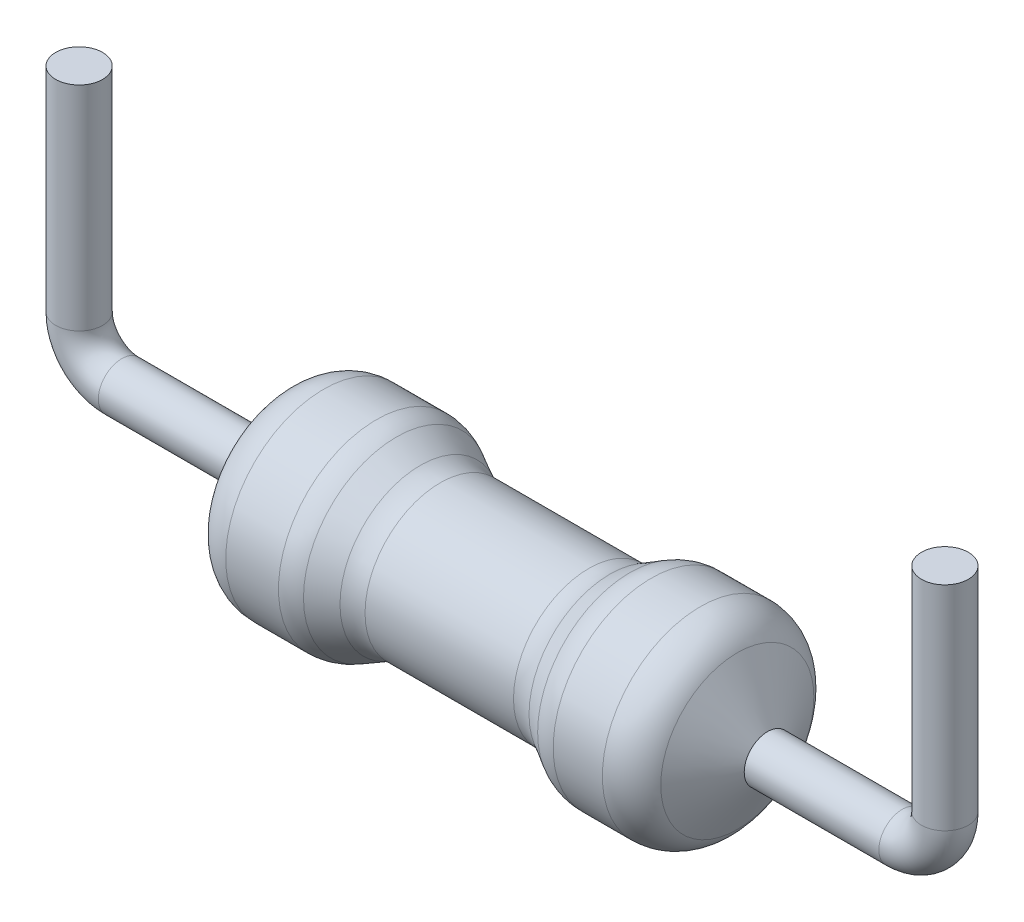
ISO-10303-21;
HEADER;
FILE_DESCRIPTION(('STEP AP214'),'2;1');
FILE_NAME('part.step','',(''),(''),'','','');
FILE_SCHEMA(('AUTOMOTIVE_DESIGN { 1 0 10303 214 1 1 1 1 }'));
ENDSEC;
DATA;
#1=APPLICATION_CONTEXT('core data for automotive mechanical design processes');
#2=APPLICATION_PROTOCOL_DEFINITION('international standard','automotive_design',2000,#1);
#3=PRODUCT_CONTEXT('',#1,'mechanical');
#4=PRODUCT('Part','Part','',(#3));
#5=PRODUCT_RELATED_PRODUCT_CATEGORY('part','',(#4));
#6=PRODUCT_DEFINITION_FORMATION('','',#4);
#7=PRODUCT_DEFINITION_CONTEXT('part definition',#1,'design');
#8=PRODUCT_DEFINITION('design','',#6,#7);
#9=PRODUCT_DEFINITION_SHAPE('','',#8);
#10=(LENGTH_UNIT() NAMED_UNIT(*) SI_UNIT(.MILLI.,.METRE.));
#11=(NAMED_UNIT(*) PLANE_ANGLE_UNIT() SI_UNIT($,.RADIAN.));
#12=(NAMED_UNIT(*) SI_UNIT($,.STERADIAN.) SOLID_ANGLE_UNIT());
#13=UNCERTAINTY_MEASURE_WITH_UNIT(LENGTH_MEASURE(1.E-05),#10,'distance_accuracy_value','');
#14=(GEOMETRIC_REPRESENTATION_CONTEXT(3) GLOBAL_UNCERTAINTY_ASSIGNED_CONTEXT((#13)) GLOBAL_UNIT_ASSIGNED_CONTEXT((#10,
#11,#12)) REPRESENTATION_CONTEXT('',''));
#15=CARTESIAN_POINT('',(0.,0.,0.));
#16=DIRECTION('',(0.,0.,1.));
#17=DIRECTION('',(1.,0.,0.));
#18=AXIS2_PLACEMENT_3D('',#15,#16,#17);
#19=CARTESIAN_POINT('',(3.,0.,0.));
#20=DIRECTION('',(-1.,0.,0.));
#21=DIRECTION('',(0.,0.,1.));
#22=AXIS2_PLACEMENT_3D('',#19,#20,#21);
#23=CONICAL_SURFACE('',#22,0.275,1.05165021254837);
#24=CARTESIAN_POINT('',(2.64396030332662,0.,0.));
#25=DIRECTION('',(1.,0.,0.));
#26=DIRECTION('',(0.,0.,-1.));
#27=AXIS2_PLACEMENT_3D('',#24,#25,#26);
#28=CIRCLE('',#27,0.898069469178417);
#29=CARTESIAN_POINT('',(2.64396030332662,0.,0.898069469178417));
#30=VERTEX_POINT('',#29);
#31=EDGE_CURVE('E11',#30,#30,#28,.T.);
#32=CARTESIAN_POINT('',(3.,0.,0.));
#33=DIRECTION('',(-1.,0.,0.));
#34=DIRECTION('',(0.,0.,1.));
#35=AXIS2_PLACEMENT_3D('',#32,#33,#34);
#36=CIRCLE('',#35,0.275);
#37=CARTESIAN_POINT('',(3.,0.,0.275));
#38=VERTEX_POINT('',#37);
#39=EDGE_CURVE('E53',#38,#38,#36,.T.);
#40=CARTESIAN_POINT('',(2.64396030332662,0.,0.898069469178417));
#41=CARTESIAN_POINT('',(2.64766905016697,0.,0.891579162207808));
#42=CARTESIAN_POINT('',(2.65137779700731,0.,0.8850888552372));
#43=CARTESIAN_POINT('',(2.65879529068801,0.,0.872108241295983));
#44=CARTESIAN_POINT('',(2.66250403752836,0.,0.865617934325374));
#45=CARTESIAN_POINT('',(2.66992153120905,0.,0.852637320384157));
#46=CARTESIAN_POINT('',(2.6736302780494,0.,0.846147013413549));
#47=CARTESIAN_POINT('',(2.6810477717301,0.,0.833166399472332));
#48=CARTESIAN_POINT('',(2.68475651857044,0.,0.826676092501723));
#49=CARTESIAN_POINT('',(2.69217401225114,0.,0.813695478560506));
#50=CARTESIAN_POINT('',(2.69588275909149,0.,0.807205171589898));
#51=CARTESIAN_POINT('',(2.70330025277218,0.,0.794224557648681));
#52=CARTESIAN_POINT('',(2.70700899961253,0.,0.787734250678072));
#53=CARTESIAN_POINT('',(2.71442649329323,0.,0.774753636736855));
#54=CARTESIAN_POINT('',(2.71813524013357,0.,0.768263329766247));
#55=CARTESIAN_POINT('',(2.72555273381427,0.,0.75528271582503));
#56=CARTESIAN_POINT('',(2.72926148065462,0.,0.748792408854421));
#57=CARTESIAN_POINT('',(2.73667897433531,0.,0.735811794913204));
#58=CARTESIAN_POINT('',(2.74038772117566,0.,0.729321487942596));
#59=CARTESIAN_POINT('',(2.74780521485635,0.,0.716340874001378));
#60=CARTESIAN_POINT('',(2.7515139616967,0.,0.70985056703077));
#61=CARTESIAN_POINT('',(2.7589314553774,0.,0.696869953089553));
#62=CARTESIAN_POINT('',(2.76264020221775,0.,0.690379646118944));
#63=CARTESIAN_POINT('',(2.77005769589844,0.,0.677399032177727));
#64=CARTESIAN_POINT('',(2.77376644273879,0.,0.670908725207119));
#65=CARTESIAN_POINT('',(2.78118393641948,0.,0.657928111265902));
#66=CARTESIAN_POINT('',(2.78489268325983,0.,0.651437804295293));
#67=CARTESIAN_POINT('',(2.79231017694053,0.,0.638457190354076));
#68=CARTESIAN_POINT('',(2.79601892378088,0.,0.631966883383468));
#69=CARTESIAN_POINT('',(2.80343641746157,0.,0.618986269442251));
#70=CARTESIAN_POINT('',(2.80714516430192,0.,0.612495962471642));
#71=CARTESIAN_POINT('',(2.81456265798261,0.,0.599515348530425));
#72=CARTESIAN_POINT('',(2.81827140482296,0.,0.593025041559817));
#73=CARTESIAN_POINT('',(2.82568889850366,0.,0.5800444276186));
#74=CARTESIAN_POINT('',(2.82939764534401,0.,0.573554120647991));
#75=CARTESIAN_POINT('',(2.8368151390247,0.,0.560573506706774));
#76=CARTESIAN_POINT('',(2.84052388586505,0.,0.554083199736166));
#77=CARTESIAN_POINT('',(2.84794137954574,0.,0.541102585794949));
#78=CARTESIAN_POINT('',(2.85165012638609,0.,0.53461227882434));
#79=CARTESIAN_POINT('',(2.85906762006679,0.,0.521631664883123));
#80=CARTESIAN_POINT('',(2.86277636690713,0.,0.515141357912515));
#81=CARTESIAN_POINT('',(2.87019386058783,0.,0.502160743971298));
#82=CARTESIAN_POINT('',(2.87390260742818,0.,0.495670437000689));
#83=CARTESIAN_POINT('',(2.88132010110887,0.,0.482689823059472));
#84=CARTESIAN_POINT('',(2.88502884794922,0.,0.476199516088863));
#85=CARTESIAN_POINT('',(2.89244634162992,0.,0.463218902147646));
#86=CARTESIAN_POINT('',(2.89615508847026,0.,0.456728595177038));
#87=CARTESIAN_POINT('',(2.90357258215096,0.,0.443747981235821));
#88=CARTESIAN_POINT('',(2.90728132899131,0.,0.437257674265212));
#89=CARTESIAN_POINT('',(2.914698822672,0.,0.424277060323995));
#90=CARTESIAN_POINT('',(2.91840756951235,0.,0.417786753353387));
#91=CARTESIAN_POINT('',(2.92582506319305,0.,0.40480613941217));
#92=CARTESIAN_POINT('',(2.92953381003339,0.,0.398315832441561));
#93=CARTESIAN_POINT('',(2.93695130371409,0.,0.385335218500344));
#94=CARTESIAN_POINT('',(2.94066005055444,0.,0.378844911529736));
#95=CARTESIAN_POINT('',(2.94807754423513,0.,0.365864297588519));
#96=CARTESIAN_POINT('',(2.95178629107548,0.,0.35937399061791));
#97=CARTESIAN_POINT('',(2.95920378475618,0.,0.346393376676693));
#98=CARTESIAN_POINT('',(2.96291253159652,0.,0.339903069706085));
#99=CARTESIAN_POINT('',(2.97033002527722,0.,0.326922455764868));
#100=CARTESIAN_POINT('',(2.97403877211757,0.,0.320432148794259));
#101=CARTESIAN_POINT('',(2.98145626579826,0.,0.307451534853042));
#102=CARTESIAN_POINT('',(2.98516501263861,0.,0.300961227882434));
#103=CARTESIAN_POINT('',(2.9925825063193,0.,0.287980613941217));
#104=CARTESIAN_POINT('',(2.99629125315965,0.,0.281490306970608));
#105=CARTESIAN_POINT('',(3.,0.,0.275));
#106=B_SPLINE_CURVE_WITH_KNOTS('',3,(#40,#41,#42,#43,#44,#45,#46,#47,#48,#49,#50,#51,#52,#53,
#54,#55,#56,#57,#58,#59,#60,#61,#62,#63,#64,#65,#66,#67,#68,#69,#70,#71,#72,#73,#74,#75,#76,#77,
#78,#79,#80,#81,#82,#83,#84,#85,#86,#87,#88,#89,#90,#91,#92,#93,#94,#95,#96,#97,#98,#99,#100,
#101,#102,#103,#104,#105),.UNSPECIFIED.,.F.,.F.,(4,2,2,2,2,2,2,2,2,2,2,2,2,2,2,2,2,2,2,2,2,2,2,
2,2,2,2,2,2,2,2,2,4),(0.,0.0224256547125532,0.0448513094251064,0.0672769641376601,
0.0897026188502135,0.112128273562767,0.13455392827532,0.156979582987874,0.179405237700427,
0.20183089241298,0.224256547125534,0.246682201838087,0.269107856550641,0.291533511263194,
0.313959165975747,0.336384820688301,0.358810475400854,0.381236130113408,0.403661784825961,
0.426087439538515,0.448513094251068,0.470938748963621,0.493364403676175,0.515790058388728,
0.538215713101281,0.560641367813835,0.583067022526388,0.605492677238942,0.627918331951495,
0.650343986664048,0.672769641376602,0.695195296089155,0.717620950801708),.UNSPECIFIED.);
#107=EDGE_CURVE('BSEAM33',#30,#38,#106,.T.);
#108=ORIENTED_EDGE('',*,*,#31,.T.);
#109=ORIENTED_EDGE('',*,*,#39,.T.);
#110=ORIENTED_EDGE('',*,*,#107,.T.);
#111=ORIENTED_EDGE('',*,*,#107,.F.);
#112=EDGE_LOOP('',(#108,#110,#109,#111));
#113=FACE_BOUND('',#112,.T.);
#114=ADVANCED_FACE('F33',(#113),#23,.T.);
#115=CARTESIAN_POINT('',(0.,0.,0.));
#116=DIRECTION('',(-1.,0.,0.));
#117=DIRECTION('',(0.,0.,1.));
#118=AXIS2_PLACEMENT_3D('',#115,#116,#117);
#119=CYLINDRICAL_SURFACE('',#118,1.15);
#120=CARTESIAN_POINT('',(1.63278221853732,0.,0.));
#121=DIRECTION('',(1.,0.,0.));
#122=DIRECTION('',(0.,0.,-1.));
#123=AXIS2_PLACEMENT_3D('',#120,#121,#122);
#124=CIRCLE('',#123,1.15);
#125=CARTESIAN_POINT('',(1.63278221853732,0.,-1.15));
#126=VERTEX_POINT('',#125);
#127=EDGE_CURVE('E41',#126,#126,#124,.T.);
#128=ORIENTED_EDGE('',*,*,#127,.T.);
#129=EDGE_LOOP('',(#128));
#130=FACE_BOUND('',#129,.T.);
#131=CARTESIAN_POINT('',(2.20983873226439,0.,0.));
#132=DIRECTION('',(1.,0.,0.));
#133=DIRECTION('',(0.,0.,-1.));
#134=AXIS2_PLACEMENT_3D('',#131,#132,#133);
#135=CIRCLE('',#134,1.15);
#136=CARTESIAN_POINT('',(2.20983873226439,0.,-1.15));
#137=VERTEX_POINT('',#136);
#138=EDGE_CURVE('E93',#137,#137,#135,.F.);
#139=ORIENTED_EDGE('',*,*,#138,.T.);
#140=EDGE_LOOP('',(#139));
#141=FACE_BOUND('',#140,.T.);
#142=ADVANCED_FACE('F98',(#130,#141),#119,.T.);
#143=CARTESIAN_POINT('',(1.5,0.,0.));
#144=DIRECTION('',(1.,0.,0.));
#145=DIRECTION('',(0.,0.,-1.));
#146=AXIS2_PLACEMENT_3D('',#143,#144,#145);
#147=CONICAL_SURFACE('',#146,1.15,0.519146114246524);
#148=CARTESIAN_POINT('',(1.14909833092873,0.,0.));
#149=DIRECTION('',(1.,0.,0.));
#150=DIRECTION('',(0.,0.,-1.));
#151=AXIS2_PLACEMENT_3D('',#148,#149,#150);
#152=CIRCLE('',#151,0.949484760530703);
#153=CARTESIAN_POINT('',(1.14909833092873,0.,-0.949484760530703));
#154=VERTEX_POINT('',#153);
#155=EDGE_CURVE('E90',#154,#154,#152,.T.);
#156=ORIENTED_EDGE('',*,*,#155,.T.);
#157=EDGE_LOOP('',(#156));
#158=FACE_BOUND('',#157,.T.);
#159=CARTESIAN_POINT('',(1.3847127493589,0.,0.));
#160=DIRECTION('',(-1.,0.,0.));
#161=DIRECTION('',(0.,0.,1.));
#162=AXIS2_PLACEMENT_3D('',#159,#160,#161);
#163=CIRCLE('',#162,1.08412157106223);
#164=CARTESIAN_POINT('',(1.3847127493589,0.,1.08412157106223));
#165=VERTEX_POINT('',#164);
#166=EDGE_CURVE('E87',#165,#165,#163,.T.);
#167=ORIENTED_EDGE('',*,*,#166,.T.);
#168=EDGE_LOOP('',(#167));
#169=FACE_BOUND('',#168,.T.);
#170=ADVANCED_FACE('F107',(#158,#169),#147,.T.);
#171=CARTESIAN_POINT('',(0.,0.,0.));
#172=DIRECTION('',(-1.,0.,0.));
#173=DIRECTION('',(0.,0.,1.));
#174=AXIS2_PLACEMENT_3D('',#171,#172,#173);
#175=CYLINDRICAL_SURFACE('',#174,0.883606331592932);
#176=CARTESIAN_POINT('',(-0.841301852192726,0.,0.));
#177=DIRECTION('',(-1.,0.,0.));
#178=DIRECTION('',(0.,0.,1.));
#179=AXIS2_PLACEMENT_3D('',#176,#177,#178);
#180=CIRCLE('',#179,0.883606331592932);
#181=CARTESIAN_POINT('',(-0.841301852192726,0.,0.883606331592932));
#182=VERTEX_POINT('',#181);
#183=EDGE_CURVE('E84',#182,#182,#180,.F.);
#184=ORIENTED_EDGE('',*,*,#183,.T.);
#185=EDGE_LOOP('',(#184));
#186=FACE_BOUND('',#185,.T.);
#187=CARTESIAN_POINT('',(0.901028861750313,0.,0.));
#188=DIRECTION('',(-1.,0.,0.));
#189=DIRECTION('',(0.,0.,1.));
#190=AXIS2_PLACEMENT_3D('',#187,#188,#189);
#191=CIRCLE('',#190,0.883606331592932);
#192=CARTESIAN_POINT('',(0.901028861750313,0.,0.883606331592932));
#193=VERTEX_POINT('',#192);
#194=EDGE_CURVE('E81',#193,#193,#191,.T.);
#195=ORIENTED_EDGE('',*,*,#194,.T.);
#196=EDGE_LOOP('',(#195));
#197=FACE_BOUND('',#196,.T.);
#198=ADVANCED_FACE('F109',(#186,#197),#175,.T.);
#199=CARTESIAN_POINT('',(-0.966188919712368,0.,0.));
#200=DIRECTION('',(-1.,0.,0.));
#201=DIRECTION('',(0.,0.,1.));
#202=AXIS2_PLACEMENT_3D('',#199,#200,#201);
#203=CONICAL_SURFACE('',#202,0.883606331592932,0.489532146090949);
#204=CARTESIAN_POINT('',(-1.3559694703309,0.,0.));
#205=DIRECTION('',(1.,0.,0.));
#206=DIRECTION('',(0.,0.,-1.));
#207=AXIS2_PLACEMENT_3D('',#204,#205,#206);
#208=CIRCLE('',#207,1.09127647309893);
#209=CARTESIAN_POINT('',(-1.3559694703309,0.,-1.09127647309893));
#210=VERTEX_POINT('',#209);
#211=EDGE_CURVE('E78',#210,#210,#208,.T.);
#212=ORIENTED_EDGE('',*,*,#211,.T.);
#213=EDGE_LOOP('',(#212));
#214=FACE_BOUND('',#213,.T.);
#215=CARTESIAN_POINT('',(-1.07640836909384,0.,0.));
#216=DIRECTION('',(-1.,0.,0.));
#217=DIRECTION('',(0.,0.,1.));
#218=AXIS2_PLACEMENT_3D('',#215,#216,#217);
#219=CIRCLE('',#218,0.942329858494006);
#220=CARTESIAN_POINT('',(-1.07640836909384,0.,0.942329858494006));
#221=VERTEX_POINT('',#220);
#222=EDGE_CURVE('E75',#221,#221,#219,.T.);
#223=ORIENTED_EDGE('',*,*,#222,.T.);
#224=EDGE_LOOP('',(#223));
#225=FACE_BOUND('',#224,.T.);
#226=ADVANCED_FACE('F116',(#214,#225),#203,.T.);
#227=CARTESIAN_POINT('',(0.,0.,0.));
#228=DIRECTION('',(-1.,0.,0.));
#229=DIRECTION('',(0.,0.,1.));
#230=AXIS2_PLACEMENT_3D('',#227,#228,#229);
#231=CYLINDRICAL_SURFACE('',#230,1.15);
#232=CARTESIAN_POINT('',(-2.20983873226439,0.,0.));
#233=DIRECTION('',(1.,0.,0.));
#234=DIRECTION('',(0.,0.,-1.));
#235=AXIS2_PLACEMENT_3D('',#232,#233,#234);
#236=CIRCLE('',#235,1.15);
#237=CARTESIAN_POINT('',(-2.20983873226439,0.,-1.15));
#238=VERTEX_POINT('',#237);
#239=EDGE_CURVE('E72',#238,#238,#236,.T.);
#240=ORIENTED_EDGE('',*,*,#239,.T.);
#241=EDGE_LOOP('',(#240));
#242=FACE_BOUND('',#241,.T.);
#243=CARTESIAN_POINT('',(-1.59107598723201,0.,0.));
#244=DIRECTION('',(1.,0.,0.));
#245=DIRECTION('',(0.,0.,-1.));
#246=AXIS2_PLACEMENT_3D('',#243,#244,#245);
#247=CIRCLE('',#246,1.15);
#248=CARTESIAN_POINT('',(-1.59107598723201,0.,-1.15));
#249=VERTEX_POINT('',#248);
#250=EDGE_CURVE('E69',#249,#249,#247,.F.);
#251=ORIENTED_EDGE('',*,*,#250,.T.);
#252=EDGE_LOOP('',(#251));
#253=FACE_BOUND('',#252,.T.);
#254=ADVANCED_FACE('F263',(#242,#253),#231,.T.);
#255=CARTESIAN_POINT('',(-2.5,0.,0.));
#256=DIRECTION('',(1.,0.,0.));
#257=DIRECTION('',(0.,0.,-1.));
#258=AXIS2_PLACEMENT_3D('',#255,#256,#257);
#259=CONICAL_SURFACE('',#258,1.15,1.05165021254837);
#260=CARTESIAN_POINT('',(-2.64396030332662,0.,0.));
#261=DIRECTION('',(-1.,0.,0.));
#262=DIRECTION('',(0.,0.,1.));
#263=AXIS2_PLACEMENT_3D('',#260,#261,#262);
#264=CIRCLE('',#263,0.898069469178417);
#265=CARTESIAN_POINT('',(-2.64396030332662,0.,-0.898069469178417));
#266=VERTEX_POINT('',#265);
#267=EDGE_CURVE('E66',#266,#266,#264,.T.);
#268=CARTESIAN_POINT('',(-3.,0.,0.));
#269=DIRECTION('',(-1.,0.,0.));
#270=DIRECTION('',(0.,0.,1.));
#271=AXIS2_PLACEMENT_3D('',#268,#269,#270);
#272=CIRCLE('',#271,0.274999999999999);
#273=CARTESIAN_POINT('',(-3.,0.,-0.274999999999999));
#274=VERTEX_POINT('',#273);
#275=EDGE_CURVE('E57',#274,#274,#272,.T.);
#276=CARTESIAN_POINT('',(-2.64396030332662,0.,-0.898069469178417));
#277=CARTESIAN_POINT('',(-2.64766905016697,0.,-0.891579162207809));
#278=CARTESIAN_POINT('',(-2.65137779700731,0.,-0.8850888552372));
#279=CARTESIAN_POINT('',(-2.65879529068801,0.,-0.872108241295983));
#280=CARTESIAN_POINT('',(-2.66250403752836,0.,-0.865617934325375));
#281=CARTESIAN_POINT('',(-2.66992153120905,0.,-0.852637320384158));
#282=CARTESIAN_POINT('',(-2.6736302780494,0.,-0.846147013413549));
#283=CARTESIAN_POINT('',(-2.6810477717301,0.,-0.833166399472332));
#284=CARTESIAN_POINT('',(-2.68475651857044,0.,-0.826676092501724));
#285=CARTESIAN_POINT('',(-2.69217401225114,0.,-0.813695478560507));
#286=CARTESIAN_POINT('',(-2.69588275909149,0.,-0.807205171589898));
#287=CARTESIAN_POINT('',(-2.70330025277218,0.,-0.794224557648681));
#288=CARTESIAN_POINT('',(-2.70700899961253,0.,-0.787734250678072));
#289=CARTESIAN_POINT('',(-2.71442649329322,0.,-0.774753636736855));
#290=CARTESIAN_POINT('',(-2.71813524013357,0.,-0.768263329766247));
#291=CARTESIAN_POINT('',(-2.72555273381427,0.,-0.75528271582503));
#292=CARTESIAN_POINT('',(-2.72926148065462,0.,-0.748792408854421));
#293=CARTESIAN_POINT('',(-2.73667897433531,0.,-0.735811794913204));
#294=CARTESIAN_POINT('',(-2.74038772117566,0.,-0.729321487942596));
#295=CARTESIAN_POINT('',(-2.74780521485635,0.,-0.716340874001379));
#296=CARTESIAN_POINT('',(-2.7515139616967,0.,-0.70985056703077));
#297=CARTESIAN_POINT('',(-2.7589314553774,0.,-0.696869953089553));
#298=CARTESIAN_POINT('',(-2.76264020221775,0.,-0.690379646118944));
#299=CARTESIAN_POINT('',(-2.77005769589844,0.,-0.677399032177727));
#300=CARTESIAN_POINT('',(-2.77376644273879,0.,-0.670908725207119));
#301=CARTESIAN_POINT('',(-2.78118393641948,0.,-0.657928111265902));
#302=CARTESIAN_POINT('',(-2.78489268325983,0.,-0.651437804295294));
#303=CARTESIAN_POINT('',(-2.79231017694053,0.,-0.638457190354076));
#304=CARTESIAN_POINT('',(-2.79601892378088,0.,-0.631966883383468));
#305=CARTESIAN_POINT('',(-2.80343641746157,0.,-0.618986269442251));
#306=CARTESIAN_POINT('',(-2.80714516430192,0.,-0.612495962471642));
#307=CARTESIAN_POINT('',(-2.81456265798261,0.,-0.599515348530425));
#308=CARTESIAN_POINT('',(-2.81827140482296,0.,-0.593025041559817));
#309=CARTESIAN_POINT('',(-2.82568889850366,0.,-0.5800444276186));
#310=CARTESIAN_POINT('',(-2.829397645344,0.,-0.573554120647991));
#311=CARTESIAN_POINT('',(-2.8368151390247,0.,-0.560573506706774));
#312=CARTESIAN_POINT('',(-2.84052388586505,0.,-0.554083199736166));
#313=CARTESIAN_POINT('',(-2.84794137954574,0.,-0.541102585794949));
#314=CARTESIAN_POINT('',(-2.85165012638609,0.,-0.53461227882434));
#315=CARTESIAN_POINT('',(-2.85906762006679,0.,-0.521631664883123));
#316=CARTESIAN_POINT('',(-2.86277636690713,0.,-0.515141357912514));
#317=CARTESIAN_POINT('',(-2.87019386058783,0.,-0.502160743971297));
#318=CARTESIAN_POINT('',(-2.87390260742818,0.,-0.495670437000689));
#319=CARTESIAN_POINT('',(-2.88132010110887,0.,-0.482689823059472));
#320=CARTESIAN_POINT('',(-2.88502884794922,0.,-0.476199516088863));
#321=CARTESIAN_POINT('',(-2.89244634162992,0.,-0.463218902147646));
#322=CARTESIAN_POINT('',(-2.89615508847026,0.,-0.456728595177038));
#323=CARTESIAN_POINT('',(-2.90357258215096,0.,-0.443747981235821));
#324=CARTESIAN_POINT('',(-2.90728132899131,0.,-0.437257674265212));
#325=CARTESIAN_POINT('',(-2.914698822672,0.,-0.424277060323995));
#326=CARTESIAN_POINT('',(-2.91840756951235,0.,-0.417786753353386));
#327=CARTESIAN_POINT('',(-2.92582506319305,0.,-0.404806139412169));
#328=CARTESIAN_POINT('',(-2.92953381003339,0.,-0.398315832441561));
#329=CARTESIAN_POINT('',(-2.93695130371409,0.,-0.385335218500344));
#330=CARTESIAN_POINT('',(-2.94066005055444,0.,-0.378844911529735));
#331=CARTESIAN_POINT('',(-2.94807754423513,0.,-0.365864297588518));
#332=CARTESIAN_POINT('',(-2.95178629107548,0.,-0.35937399061791));
#333=CARTESIAN_POINT('',(-2.95920378475618,0.,-0.346393376676693));
#334=CARTESIAN_POINT('',(-2.96291253159652,0.,-0.339903069706084));
#335=CARTESIAN_POINT('',(-2.97033002527722,0.,-0.326922455764867));
#336=CARTESIAN_POINT('',(-2.97403877211757,0.,-0.320432148794259));
#337=CARTESIAN_POINT('',(-2.98145626579826,0.,-0.307451534853042));
#338=CARTESIAN_POINT('',(-2.98516501263861,0.,-0.300961227882433));
#339=CARTESIAN_POINT('',(-2.9925825063193,0.,-0.287980613941216));
#340=CARTESIAN_POINT('',(-2.99629125315965,0.,-0.281490306970608));
#341=CARTESIAN_POINT('',(-3.,0.,-0.274999999999999));
#342=B_SPLINE_CURVE_WITH_KNOTS('',3,(#276,#277,#278,#279,#280,#281,#282,#283,#284,#285,#286,
#287,#288,#289,#290,#291,#292,#293,#294,#295,#296,#297,#298,#299,#300,#301,#302,#303,#304,#305,
#306,#307,#308,#309,#310,#311,#312,#313,#314,#315,#316,#317,#318,#319,#320,#321,#322,#323,#324,
#325,#326,#327,#328,#329,#330,#331,#332,#333,#334,#335,#336,#337,#338,#339,#340,#341),
.UNSPECIFIED.,.F.,.F.,(4,2,2,2,2,2,2,2,2,2,2,2,2,2,2,2,2,2,2,2,2,2,2,2,2,2,2,2,2,2,2,2,4),(0.,
0.0224256547125532,0.0448513094251066,0.0672769641376601,0.0897026188502136,0.112128273562767,
0.13455392827532,0.156979582987874,0.179405237700427,0.201830892412981,0.224256547125534,
0.246682201838088,0.269107856550641,0.291533511263194,0.313959165975748,0.336384820688301,
0.358810475400855,0.381236130113408,0.403661784825961,0.426087439538515,0.448513094251068,
0.470938748963622,0.493364403676175,0.515790058388729,0.538215713101282,0.560641367813836,
0.583067022526389,0.605492677238942,0.627918331951496,0.650343986664049,0.672769641376603,
0.695195296089156,0.71762095080171),.UNSPECIFIED.);
#343=EDGE_CURVE('BSEAM131',#266,#274,#342,.T.);
#344=ORIENTED_EDGE('',*,*,#267,.T.);
#345=ORIENTED_EDGE('',*,*,#275,.F.);
#346=ORIENTED_EDGE('',*,*,#343,.T.);
#347=ORIENTED_EDGE('',*,*,#343,.F.);
#348=EDGE_LOOP('',(#344,#346,#345,#347));
#349=FACE_BOUND('',#348,.T.);
#350=ADVANCED_FACE('F131',(#349),#259,.T.);
#351=CARTESIAN_POINT('',(-2.20983873226439,0.,0.));
#352=DIRECTION('',(1.,0.,0.));
#353=DIRECTION('',(0.,0.,-1.));
#354=AXIS2_PLACEMENT_3D('',#351,#352,#353);
#355=TOROIDAL_SURFACE('',#354,0.65,0.5);
#356=ORIENTED_EDGE('',*,*,#239,.F.);
#357=EDGE_LOOP('',(#356));
#358=FACE_BOUND('',#357,.T.);
#359=ORIENTED_EDGE('',*,*,#267,.F.);
#360=EDGE_LOOP('',(#359));
#361=FACE_BOUND('',#360,.T.);
#362=ADVANCED_FACE('F127',(#358,#361),#355,.T.);
#363=CARTESIAN_POINT('',(-1.59107598723201,0.,0.));
#364=DIRECTION('',(1.,0.,0.));
#365=DIRECTION('',(0.,0.,-1.));
#366=AXIS2_PLACEMENT_3D('',#363,#364,#365);
#367=TOROIDAL_SURFACE('',#366,0.65,0.5);
#368=ORIENTED_EDGE('',*,*,#211,.F.);
#369=EDGE_LOOP('',(#368));
#370=FACE_BOUND('',#369,.T.);
#371=ORIENTED_EDGE('',*,*,#250,.F.);
#372=EDGE_LOOP('',(#371));
#373=FACE_BOUND('',#372,.T.);
#374=ADVANCED_FACE('F130',(#370,#373),#367,.T.);
#375=CARTESIAN_POINT('',(-0.841301852192726,0.,0.));
#376=DIRECTION('',(-1.,0.,0.));
#377=DIRECTION('',(0.,0.,1.));
#378=AXIS2_PLACEMENT_3D('',#375,#376,#377);
#379=TOROIDAL_SURFACE('',#378,1.38360633159293,0.5);
#380=ORIENTED_EDGE('',*,*,#183,.F.);
#381=EDGE_LOOP('',(#380));
#382=FACE_BOUND('',#381,.T.);
#383=ORIENTED_EDGE('',*,*,#222,.F.);
#384=EDGE_LOOP('',(#383));
#385=FACE_BOUND('',#384,.T.);
#386=ADVANCED_FACE('F135',(#382,#385),#379,.F.);
#387=CARTESIAN_POINT('',(0.901028861750313,0.,0.));
#388=DIRECTION('',(-1.,0.,0.));
#389=DIRECTION('',(0.,0.,1.));
#390=AXIS2_PLACEMENT_3D('',#387,#388,#389);
#391=TOROIDAL_SURFACE('',#390,1.38360633159293,0.5);
#392=ORIENTED_EDGE('',*,*,#155,.F.);
#393=EDGE_LOOP('',(#392));
#394=FACE_BOUND('',#393,.T.);
#395=ORIENTED_EDGE('',*,*,#194,.F.);
#396=EDGE_LOOP('',(#395));
#397=FACE_BOUND('',#396,.T.);
#398=ADVANCED_FACE('F104',(#394,#397),#391,.F.);
#399=CARTESIAN_POINT('',(1.63278221853732,0.,0.));
#400=DIRECTION('',(1.,0.,0.));
#401=DIRECTION('',(0.,0.,-1.));
#402=AXIS2_PLACEMENT_3D('',#399,#400,#401);
#403=TOROIDAL_SURFACE('',#402,0.65,0.5);
#404=ORIENTED_EDGE('',*,*,#127,.F.);
#405=EDGE_LOOP('',(#404));
#406=FACE_BOUND('',#405,.T.);
#407=ORIENTED_EDGE('',*,*,#166,.F.);
#408=EDGE_LOOP('',(#407));
#409=FACE_BOUND('',#408,.T.);
#410=ADVANCED_FACE('F101',(#406,#409),#403,.T.);
#411=CARTESIAN_POINT('',(2.20983873226439,0.,0.));
#412=DIRECTION('',(1.,0.,0.));
#413=DIRECTION('',(0.,0.,-1.));
#414=AXIS2_PLACEMENT_3D('',#411,#412,#413);
#415=TOROIDAL_SURFACE('',#414,0.65,0.5);
#416=ORIENTED_EDGE('',*,*,#31,.F.);
#417=EDGE_LOOP('',(#416));
#418=FACE_BOUND('',#417,.T.);
#419=ORIENTED_EDGE('',*,*,#138,.F.);
#420=EDGE_LOOP('',(#419));
#421=FACE_BOUND('',#420,.T.);
#422=ADVANCED_FACE('F35',(#418,#421),#415,.T.);
#423=CARTESIAN_POINT('',(-5.08,3.,0.));
#424=DIRECTION('',(0.,-1.,0.));
#425=DIRECTION('',(0.,0.,-1.));
#426=AXIS2_PLACEMENT_3D('',#423,#424,#425);
#427=PLANE('',#426);
#428=CARTESIAN_POINT('',(-5.08,3.,0.));
#429=DIRECTION('',(0.,-1.,0.));
#430=DIRECTION('',(0.,0.,-1.));
#431=AXIS2_PLACEMENT_3D('',#428,#429,#430);
#432=CIRCLE('',#431,0.275);
#433=CARTESIAN_POINT('',(-5.08,3.,-0.275));
#434=VERTEX_POINT('',#433);
#435=EDGE_CURVE('E46',#434,#434,#432,.T.);
#436=ORIENTED_EDGE('',*,*,#435,.F.);
#437=EDGE_LOOP('',(#436));
#438=FACE_BOUND('',#437,.T.);
#439=ADVANCED_FACE('F160',(#438),#427,.F.);
#440=CARTESIAN_POINT('',(-5.08,3.,0.));
#441=DIRECTION('',(0.,-1.,0.));
#442=DIRECTION('',(0.,0.,-1.));
#443=AXIS2_PLACEMENT_3D('',#440,#441,#442);
#444=CYLINDRICAL_SURFACE('',#443,0.275);
#445=CARTESIAN_POINT('',(-5.08,0.499999999999999,0.));
#446=DIRECTION('',(0.,-1.,0.));
#447=DIRECTION('',(0.,0.,-1.));
#448=AXIS2_PLACEMENT_3D('',#445,#446,#447);
#449=CIRCLE('',#448,0.275);
#450=CARTESIAN_POINT('',(-5.355,0.499999999999999,0.));
#451=VERTEX_POINT('',#450);
#452=EDGE_CURVE('E327',#451,#451,#449,.T.);
#453=ORIENTED_EDGE('',*,*,#452,.F.);
#454=EDGE_LOOP('',(#453));
#455=FACE_BOUND('',#454,.T.);
#456=ORIENTED_EDGE('',*,*,#435,.T.);
#457=EDGE_LOOP('',(#456));
#458=FACE_BOUND('',#457,.T.);
#459=ADVANCED_FACE('F167',(#455,#458),#444,.T.);
#460=CARTESIAN_POINT('',(-4.58,0.499999999999999,0.));
#461=DIRECTION('',(0.,0.,1.));
#462=DIRECTION('',(1.,0.,0.));
#463=AXIS2_PLACEMENT_3D('',#460,#461,#462);
#464=TOROIDAL_SURFACE('',#463,0.5,0.275);
#465=CARTESIAN_POINT('',(-4.58,0.,0.));
#466=DIRECTION('',(1.,0.,0.));
#467=DIRECTION('',(0.,0.,-1.));
#468=AXIS2_PLACEMENT_3D('',#465,#466,#467);
#469=CIRCLE('',#468,0.275);
#470=CARTESIAN_POINT('',(-4.57999999999999,-0.275000000000001,0.));
#471=VERTEX_POINT('',#470);
#472=EDGE_CURVE('E325',#471,#471,#469,.T.);
#473=CARTESIAN_POINT('',(-4.58,0.499999999999999,0.));
#474=DIRECTION('',(0.,0.,1.));
#475=DIRECTION('',(1.,0.,0.));
#476=AXIS2_PLACEMENT_3D('',#473,#474,#475);
#477=CIRCLE('',#476,0.775);
#478=EDGE_CURVE('',#451,#471,#477,.T.);
#479=ORIENTED_EDGE('',*,*,#452,.T.);
#480=ORIENTED_EDGE('',*,*,#472,.F.);
#481=ORIENTED_EDGE('',*,*,#478,.T.);
#482=ORIENTED_EDGE('',*,*,#478,.F.);
#483=EDGE_LOOP('',(#479,#481,#480,#482));
#484=FACE_BOUND('',#483,.T.);
#485=ADVANCED_FACE('F174',(#484),#464,.T.);
#486=CARTESIAN_POINT('',(-4.58,0.,0.));
#487=DIRECTION('',(1.,0.,0.));
#488=DIRECTION('',(0.,1.,0.));
#489=AXIS2_PLACEMENT_3D('',#486,#487,#488);
#490=CYLINDRICAL_SURFACE('',#489,0.275);
#491=ORIENTED_EDGE('',*,*,#472,.T.);
#492=EDGE_LOOP('',(#491));
#493=FACE_BOUND('',#492,.T.);
#494=ORIENTED_EDGE('',*,*,#275,.T.);
#495=EDGE_LOOP('',(#494));
#496=FACE_BOUND('',#495,.T.);
#497=ADVANCED_FACE('F182',(#493,#496),#490,.T.);
#498=CARTESIAN_POINT('',(4.58,0.,0.));
#499=DIRECTION('',(1.,0.,0.));
#500=DIRECTION('',(0.,0.,-1.));
#501=AXIS2_PLACEMENT_3D('',#498,#499,#500);
#502=CIRCLE('',#501,0.275);
#503=CARTESIAN_POINT('',(4.57999999999999,-0.274999999999973,0.));
#504=VERTEX_POINT('',#503);
#505=EDGE_CURVE('E60',#504,#504,#502,.T.);
#506=ORIENTED_EDGE('',*,*,#505,.F.);
#507=EDGE_LOOP('',(#506));
#508=FACE_BOUND('',#507,.T.);
#509=ORIENTED_EDGE('',*,*,#39,.F.);
#510=EDGE_LOOP('',(#509));
#511=FACE_BOUND('',#510,.T.);
#512=ADVANCED_FACE('F190',(#508,#511),#490,.T.);
#513=CARTESIAN_POINT('',(5.08,3.,0.));
#514=DIRECTION('',(0.,1.,0.));
#515=DIRECTION('',(0.,0.,-1.));
#516=AXIS2_PLACEMENT_3D('',#513,#514,#515);
#517=PLANE('',#516);
#518=CARTESIAN_POINT('',(5.08,3.,0.));
#519=DIRECTION('',(0.,1.,0.));
#520=DIRECTION('',(0.,0.,-1.));
#521=AXIS2_PLACEMENT_3D('',#518,#519,#520);
#522=CIRCLE('',#521,0.275);
#523=CARTESIAN_POINT('',(5.08,3.,-0.275));
#524=VERTEX_POINT('',#523);
#525=EDGE_CURVE('E50',#524,#524,#522,.T.);
#526=ORIENTED_EDGE('',*,*,#525,.T.);
#527=EDGE_LOOP('',(#526));
#528=FACE_BOUND('',#527,.T.);
#529=ADVANCED_FACE('F51',(#528),#517,.T.);
#530=CARTESIAN_POINT('',(4.58,0.5,0.));
#531=DIRECTION('',(0.,0.,1.));
#532=DIRECTION('',(1.,0.,0.));
#533=AXIS2_PLACEMENT_3D('',#530,#531,#532);
#534=TOROIDAL_SURFACE('',#533,0.499999999999973,0.275);
#535=CARTESIAN_POINT('',(5.08,0.5,0.));
#536=DIRECTION('',(0.,1.,0.));
#537=DIRECTION('',(0.,0.,-1.));
#538=AXIS2_PLACEMENT_3D('',#535,#536,#537);
#539=CIRCLE('',#538,0.275);
#540=CARTESIAN_POINT('',(5.35499999999997,0.5,0.));
#541=VERTEX_POINT('',#540);
#542=EDGE_CURVE('E54',#541,#541,#539,.T.);
#543=CARTESIAN_POINT('',(4.58,0.5,0.));
#544=DIRECTION('',(0.,0.,1.));
#545=DIRECTION('',(1.,0.,0.));
#546=AXIS2_PLACEMENT_3D('',#543,#544,#545);
#547=CIRCLE('',#546,0.774999999999973);
#548=EDGE_CURVE('',#504,#541,#547,.T.);
#549=ORIENTED_EDGE('',*,*,#505,.T.);
#550=ORIENTED_EDGE('',*,*,#542,.F.);
#551=ORIENTED_EDGE('',*,*,#548,.T.);
#552=ORIENTED_EDGE('',*,*,#548,.F.);
#553=EDGE_LOOP('',(#549,#551,#550,#552));
#554=FACE_BOUND('',#553,.T.);
#555=ADVANCED_FACE('F205',(#554),#534,.T.);
#556=CARTESIAN_POINT('',(5.08,0.500000000000003,0.));
#557=DIRECTION('',(0.,1.,0.));
#558=DIRECTION('',(0.,0.,1.));
#559=AXIS2_PLACEMENT_3D('',#556,#557,#558);
#560=CYLINDRICAL_SURFACE('',#559,0.275);
#561=ORIENTED_EDGE('',*,*,#525,.F.);
#562=EDGE_LOOP('',(#561));
#563=FACE_BOUND('',#562,.T.);
#564=ORIENTED_EDGE('',*,*,#542,.T.);
#565=EDGE_LOOP('',(#564));
#566=FACE_BOUND('',#565,.T.);
#567=ADVANCED_FACE('F199',(#563,#566),#560,.T.);
#568=CLOSED_SHELL('',(#114,#142,#170,#198,#226,#254,#350,#362,#374,#386,#398,#410,#422,#439,
#459,#485,#497,#512,#529,#555,#567));
#569=MANIFOLD_SOLID_BREP('B2',#568);
#570=ADVANCED_BREP_SHAPE_REPRESENTATION('',(#18,#569),#14);
#571=SHAPE_DEFINITION_REPRESENTATION(#9,#570);
ENDSEC;
END-ISO-10303-21;
